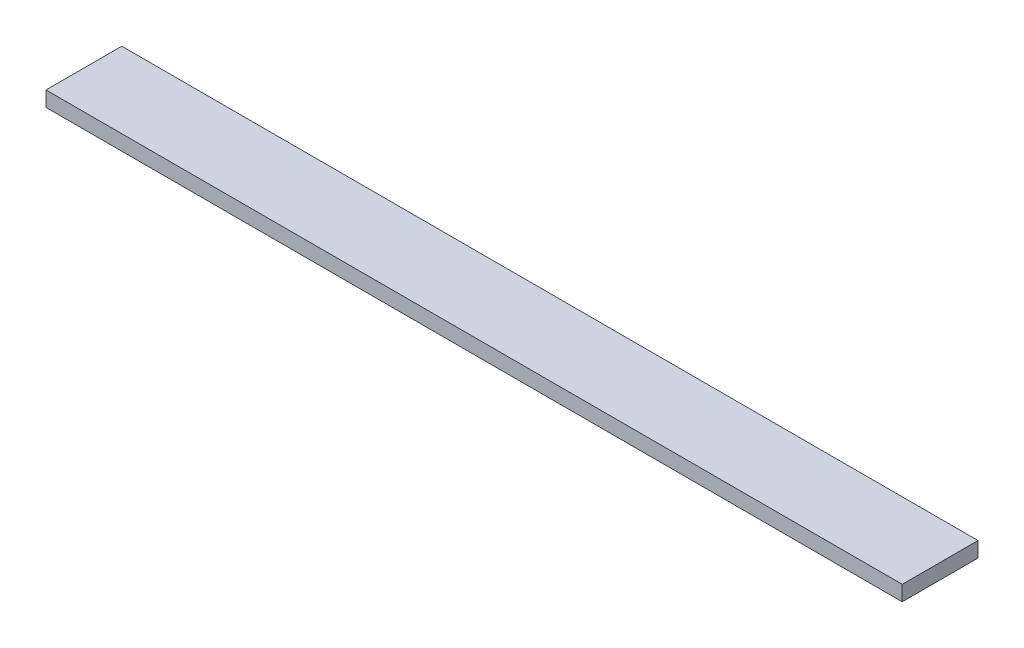
ISO-10303-21;
HEADER;
FILE_DESCRIPTION(('STEP AP214'),'2;1');
FILE_NAME('part.step','',(''),(''),'','','');
FILE_SCHEMA(('AUTOMOTIVE_DESIGN { 1 0 10303 214 1 1 1 1 }'));
ENDSEC;
DATA;
#1=APPLICATION_CONTEXT('core data for automotive mechanical design processes');
#2=APPLICATION_PROTOCOL_DEFINITION('international standard','automotive_design',2000,#1);
#3=PRODUCT_CONTEXT('',#1,'mechanical');
#4=PRODUCT('Part','Part','',(#3));
#5=PRODUCT_RELATED_PRODUCT_CATEGORY('part','',(#4));
#6=PRODUCT_DEFINITION_FORMATION('','',#4);
#7=PRODUCT_DEFINITION_CONTEXT('part definition',#1,'design');
#8=PRODUCT_DEFINITION('design','',#6,#7);
#9=PRODUCT_DEFINITION_SHAPE('','',#8);
#10=(LENGTH_UNIT() NAMED_UNIT(*) SI_UNIT(.MILLI.,.METRE.));
#11=(NAMED_UNIT(*) PLANE_ANGLE_UNIT() SI_UNIT($,.RADIAN.));
#12=(NAMED_UNIT(*) SI_UNIT($,.STERADIAN.) SOLID_ANGLE_UNIT());
#13=UNCERTAINTY_MEASURE_WITH_UNIT(LENGTH_MEASURE(1.E-05),#10,'distance_accuracy_value','');
#14=(GEOMETRIC_REPRESENTATION_CONTEXT(3) GLOBAL_UNCERTAINTY_ASSIGNED_CONTEXT((#13)) GLOBAL_UNIT_ASSIGNED_CONTEXT((#10,
#11,#12)) REPRESENTATION_CONTEXT('',''));
#15=CARTESIAN_POINT('',(0.,0.,0.));
#16=DIRECTION('',(0.,0.,1.));
#17=DIRECTION('',(1.,0.,0.));
#18=AXIS2_PLACEMENT_3D('',#15,#16,#17);
#19=CARTESIAN_POINT('',(0.,2.,0.));
#20=DIRECTION('',(1.,0.,0.));
#21=DIRECTION('',(0.,0.,-1.));
#22=AXIS2_PLACEMENT_3D('',#19,#20,#21);
#23=PLANE('',#22);
#24=DIRECTION('',(0.,0.,1.));
#25=VECTOR('',#24,1.);
#26=CARTESIAN_POINT('',(0.,0.,0.));
#27=LINE('',#26,#25);
#28=CARTESIAN_POINT('',(0.,0.,-10.));
#29=VERTEX_POINT('',#28);
#30=CARTESIAN_POINT('',(0.,0.,0.));
#31=VERTEX_POINT('',#30);
#32=EDGE_CURVE('E107',#29,#31,#27,.T.);
#33=ORIENTED_EDGE('',*,*,#32,.T.);
#34=DIRECTION('',(0.,-1.,0.));
#35=VECTOR('',#34,1.);
#36=CARTESIAN_POINT('',(0.,2.,0.));
#37=LINE('',#36,#35);
#38=CARTESIAN_POINT('',(0.,2.,0.));
#39=VERTEX_POINT('',#38);
#40=EDGE_CURVE('E11',#39,#31,#37,.T.);
#41=ORIENTED_EDGE('',*,*,#40,.F.);
#42=DIRECTION('',(0.,0.,1.));
#43=VECTOR('',#42,1.);
#44=CARTESIAN_POINT('',(0.,2.,0.));
#45=LINE('',#44,#43);
#46=CARTESIAN_POINT('',(0.,2.,-10.));
#47=VERTEX_POINT('',#46);
#48=EDGE_CURVE('E91',#47,#39,#45,.T.);
#49=ORIENTED_EDGE('',*,*,#48,.F.);
#50=DIRECTION('',(0.,-1.,0.));
#51=VECTOR('',#50,1.);
#52=CARTESIAN_POINT('',(0.,2.,-10.));
#53=LINE('',#52,#51);
#54=EDGE_CURVE('E103',#47,#29,#53,.T.);
#55=ORIENTED_EDGE('',*,*,#54,.T.);
#56=EDGE_LOOP('',(#33,#41,#49,#55));
#57=FACE_BOUND('',#56,.T.);
#58=ADVANCED_FACE('F39',(#57),#23,.F.);
#59=CARTESIAN_POINT('',(0.,2.,0.));
#60=DIRECTION('',(0.,0.,-1.));
#61=DIRECTION('',(-1.,0.,0.));
#62=AXIS2_PLACEMENT_3D('',#59,#60,#61);
#63=PLANE('',#62);
#64=DIRECTION('',(1.,0.,0.));
#65=VECTOR('',#64,1.);
#66=CARTESIAN_POINT('',(0.,0.,0.));
#67=LINE('',#66,#65);
#68=CARTESIAN_POINT('',(113.,0.,0.));
#69=VERTEX_POINT('',#68);
#70=EDGE_CURVE('E96',#31,#69,#67,.T.);
#71=ORIENTED_EDGE('',*,*,#70,.T.);
#72=DIRECTION('',(0.,-1.,0.));
#73=VECTOR('',#72,1.);
#74=CARTESIAN_POINT('',(113.,2.,0.));
#75=LINE('',#74,#73);
#76=CARTESIAN_POINT('',(113.,2.,0.));
#77=VERTEX_POINT('',#76);
#78=EDGE_CURVE('E48',#77,#69,#75,.T.);
#79=ORIENTED_EDGE('',*,*,#78,.F.);
#80=DIRECTION('',(1.,0.,0.));
#81=VECTOR('',#80,1.);
#82=CARTESIAN_POINT('',(0.,2.,0.));
#83=LINE('',#82,#81);
#84=EDGE_CURVE('E86',#39,#77,#83,.T.);
#85=ORIENTED_EDGE('',*,*,#84,.F.);
#86=ORIENTED_EDGE('',*,*,#40,.T.);
#87=EDGE_LOOP('',(#71,#79,#85,#86));
#88=FACE_BOUND('',#87,.T.);
#89=ADVANCED_FACE('F95',(#88),#63,.F.);
#90=CARTESIAN_POINT('',(113.,2.,0.));
#91=DIRECTION('',(-1.,0.,0.));
#92=DIRECTION('',(0.,0.,1.));
#93=AXIS2_PLACEMENT_3D('',#90,#91,#92);
#94=PLANE('',#93);
#95=DIRECTION('',(0.,0.,-1.));
#96=VECTOR('',#95,1.);
#97=CARTESIAN_POINT('',(113.,0.,0.));
#98=LINE('',#97,#96);
#99=CARTESIAN_POINT('',(113.,0.,-10.));
#100=VERTEX_POINT('',#99);
#101=EDGE_CURVE('E73',#69,#100,#98,.T.);
#102=ORIENTED_EDGE('',*,*,#101,.T.);
#103=DIRECTION('',(0.,-1.,0.));
#104=VECTOR('',#103,1.);
#105=CARTESIAN_POINT('',(113.,2.,-10.));
#106=LINE('',#105,#104);
#107=CARTESIAN_POINT('',(113.,2.,-10.));
#108=VERTEX_POINT('',#107);
#109=EDGE_CURVE('E98',#108,#100,#106,.T.);
#110=ORIENTED_EDGE('',*,*,#109,.F.);
#111=DIRECTION('',(0.,0.,-1.));
#112=VECTOR('',#111,1.);
#113=CARTESIAN_POINT('',(113.,2.,0.));
#114=LINE('',#113,#112);
#115=EDGE_CURVE('E89',#77,#108,#114,.T.);
#116=ORIENTED_EDGE('',*,*,#115,.F.);
#117=ORIENTED_EDGE('',*,*,#78,.T.);
#118=EDGE_LOOP('',(#102,#110,#116,#117));
#119=FACE_BOUND('',#118,.T.);
#120=ADVANCED_FACE('F99',(#119),#94,.F.);
#121=CARTESIAN_POINT('',(0.,2.,-10.));
#122=DIRECTION('',(0.,0.,1.));
#123=DIRECTION('',(1.,0.,0.));
#124=AXIS2_PLACEMENT_3D('',#121,#122,#123);
#125=PLANE('',#124);
#126=DIRECTION('',(-1.,0.,0.));
#127=VECTOR('',#126,1.);
#128=CARTESIAN_POINT('',(0.,0.,-10.));
#129=LINE('',#128,#127);
#130=EDGE_CURVE('E79',#100,#29,#129,.T.);
#131=ORIENTED_EDGE('',*,*,#130,.T.);
#132=ORIENTED_EDGE('',*,*,#54,.F.);
#133=DIRECTION('',(-1.,0.,0.));
#134=VECTOR('',#133,1.);
#135=CARTESIAN_POINT('',(0.,2.,-10.));
#136=LINE('',#135,#134);
#137=EDGE_CURVE('E56',#108,#47,#136,.T.);
#138=ORIENTED_EDGE('',*,*,#137,.F.);
#139=ORIENTED_EDGE('',*,*,#109,.T.);
#140=EDGE_LOOP('',(#131,#132,#138,#139));
#141=FACE_BOUND('',#140,.T.);
#142=ADVANCED_FACE('F120',(#141),#125,.F.);
#143=CARTESIAN_POINT('',(0.,2.,0.));
#144=DIRECTION('',(0.,-1.,0.));
#145=DIRECTION('',(0.,0.,-1.));
#146=AXIS2_PLACEMENT_3D('',#143,#144,#145);
#147=PLANE('',#146);
#148=ORIENTED_EDGE('',*,*,#48,.T.);
#149=ORIENTED_EDGE('',*,*,#84,.T.);
#150=ORIENTED_EDGE('',*,*,#115,.T.);
#151=ORIENTED_EDGE('',*,*,#137,.T.);
#152=EDGE_LOOP('',(#148,#149,#150,#151));
#153=FACE_BOUND('',#152,.T.);
#154=ADVANCED_FACE('F87',(#153),#147,.F.);
#155=CARTESIAN_POINT('',(0.,0.,0.));
#156=DIRECTION('',(0.,-1.,0.));
#157=DIRECTION('',(0.,0.,-1.));
#158=AXIS2_PLACEMENT_3D('',#155,#156,#157);
#159=PLANE('',#158);
#160=ORIENTED_EDGE('',*,*,#32,.F.);
#161=ORIENTED_EDGE('',*,*,#130,.F.);
#162=ORIENTED_EDGE('',*,*,#101,.F.);
#163=ORIENTED_EDGE('',*,*,#70,.F.);
#164=EDGE_LOOP('',(#160,#161,#162,#163));
#165=FACE_BOUND('',#164,.T.);
#166=ADVANCED_FACE('F123',(#165),#159,.T.);
#167=CLOSED_SHELL('',(#58,#89,#120,#142,#154,#166));
#168=MANIFOLD_SOLID_BREP('B2',#167);
#169=ADVANCED_BREP_SHAPE_REPRESENTATION('',(#18,#168),#14);
#170=SHAPE_DEFINITION_REPRESENTATION(#9,#169);
ENDSEC;
END-ISO-10303-21;
